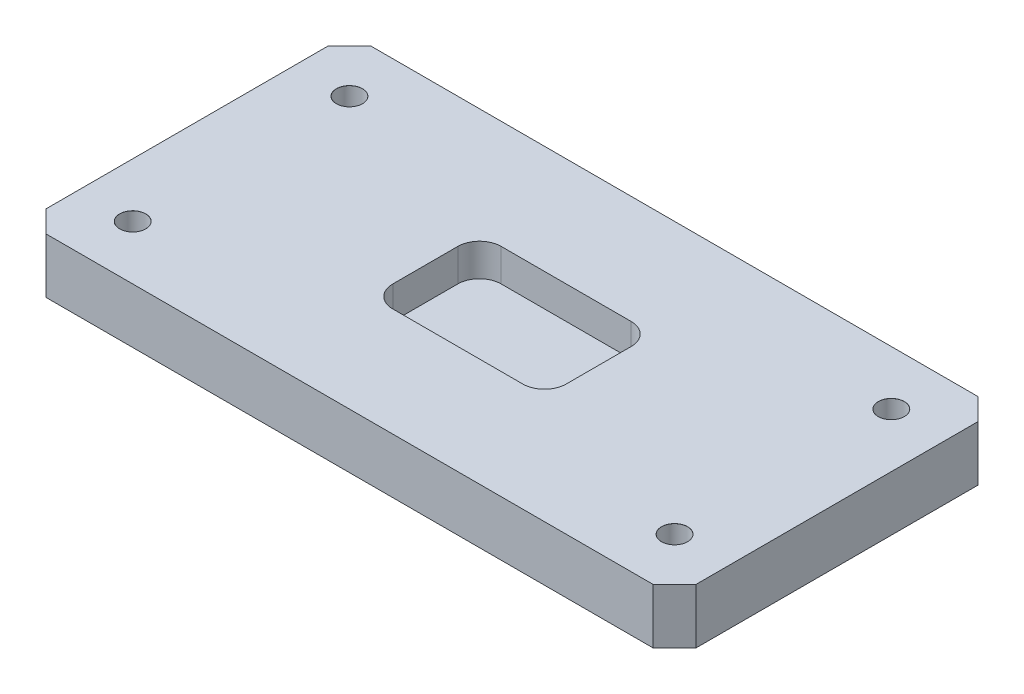
ISO-10303-21;
HEADER;
FILE_DESCRIPTION(('STEP AP214'),'2;1');
FILE_NAME('part.step','',(''),(''),'','','');
FILE_SCHEMA(('AUTOMOTIVE_DESIGN { 1 0 10303 214 1 1 1 1 }'));
ENDSEC;
DATA;
#1=APPLICATION_CONTEXT('core data for automotive mechanical design processes');
#2=APPLICATION_PROTOCOL_DEFINITION('international standard','automotive_design',2000,#1);
#3=PRODUCT_CONTEXT('',#1,'mechanical');
#4=PRODUCT('Part','Part','',(#3));
#5=PRODUCT_RELATED_PRODUCT_CATEGORY('part','',(#4));
#6=PRODUCT_DEFINITION_FORMATION('','',#4);
#7=PRODUCT_DEFINITION_CONTEXT('part definition',#1,'design');
#8=PRODUCT_DEFINITION('design','',#6,#7);
#9=PRODUCT_DEFINITION_SHAPE('','',#8);
#10=(LENGTH_UNIT() NAMED_UNIT(*) SI_UNIT(.MILLI.,.METRE.));
#11=(NAMED_UNIT(*) PLANE_ANGLE_UNIT() SI_UNIT($,.RADIAN.));
#12=(NAMED_UNIT(*) SI_UNIT($,.STERADIAN.) SOLID_ANGLE_UNIT());
#13=UNCERTAINTY_MEASURE_WITH_UNIT(LENGTH_MEASURE(1.E-05),#10,'distance_accuracy_value','');
#14=(GEOMETRIC_REPRESENTATION_CONTEXT(3) GLOBAL_UNCERTAINTY_ASSIGNED_CONTEXT((#13)) GLOBAL_UNIT_ASSIGNED_CONTEXT((#10,
#11,#12)) REPRESENTATION_CONTEXT('',''));
#15=CARTESIAN_POINT('',(0.,0.,0.));
#16=DIRECTION('',(0.,0.,1.));
#17=DIRECTION('',(1.,0.,0.));
#18=AXIS2_PLACEMENT_3D('',#15,#16,#17);
#19=CARTESIAN_POINT('',(140.,25.4,-75.));
#20=DIRECTION('',(-0.707106781186547,0.,0.707106781186548));
#21=DIRECTION('',(0.707106781186548,0.,0.707106781186547));
#22=AXIS2_PLACEMENT_3D('',#19,#20,#21);
#23=PLANE('',#22);
#24=DIRECTION('',(-0.707106781186548,0.,-0.707106781186547));
#25=VECTOR('',#24,1.);
#26=CARTESIAN_POINT('',(140.,0.,-75.));
#27=LINE('',#26,#25);
#28=CARTESIAN_POINT('',(150.,0.,-65.));
#29=VERTEX_POINT('',#28);
#30=CARTESIAN_POINT('',(140.,0.,-75.));
#31=VERTEX_POINT('',#30);
#32=EDGE_CURVE('E188',#29,#31,#27,.T.);
#33=ORIENTED_EDGE('',*,*,#32,.T.);
#34=DIRECTION('',(0.,-1.,0.));
#35=VECTOR('',#34,1.);
#36=CARTESIAN_POINT('',(140.,25.4,-75.));
#37=LINE('',#36,#35);
#38=CARTESIAN_POINT('',(140.,25.4,-75.));
#39=VERTEX_POINT('',#38);
#40=EDGE_CURVE('E167',#39,#31,#37,.T.);
#41=ORIENTED_EDGE('',*,*,#40,.F.);
#42=DIRECTION('',(-0.707106781186548,0.,-0.707106781186547));
#43=VECTOR('',#42,1.);
#44=CARTESIAN_POINT('',(140.,25.4,-75.));
#45=LINE('',#44,#43);
#46=CARTESIAN_POINT('',(150.,25.4,-65.));
#47=VERTEX_POINT('',#46);
#48=EDGE_CURVE('E175',#47,#39,#45,.T.);
#49=ORIENTED_EDGE('',*,*,#48,.F.);
#50=DIRECTION('',(0.,-1.,0.));
#51=VECTOR('',#50,1.);
#52=CARTESIAN_POINT('',(150.,25.4,-65.));
#53=LINE('',#52,#51);
#54=EDGE_CURVE('E374',#47,#29,#53,.T.);
#55=ORIENTED_EDGE('',*,*,#54,.T.);
#56=EDGE_LOOP('',(#33,#41,#49,#55));
#57=FACE_BOUND('',#56,.T.);
#58=ADVANCED_FACE('F50',(#57),#23,.F.);
#59=CARTESIAN_POINT('',(-140.,25.4,-75.));
#60=DIRECTION('',(0.,0.,1.));
#61=DIRECTION('',(1.,0.,0.));
#62=AXIS2_PLACEMENT_3D('',#59,#60,#61);
#63=PLANE('',#62);
#64=DIRECTION('',(-1.,0.,0.));
#65=VECTOR('',#64,1.);
#66=CARTESIAN_POINT('',(-140.,0.,-75.));
#67=LINE('',#66,#65);
#68=CARTESIAN_POINT('',(-140.,0.,-75.));
#69=VERTEX_POINT('',#68);
#70=EDGE_CURVE('E377',#31,#69,#67,.T.);
#71=ORIENTED_EDGE('',*,*,#70,.T.);
#72=DIRECTION('',(0.,-1.,0.));
#73=VECTOR('',#72,1.);
#74=CARTESIAN_POINT('',(-140.,25.4,-75.));
#75=LINE('',#74,#73);
#76=CARTESIAN_POINT('',(-140.,25.4,-75.));
#77=VERTEX_POINT('',#76);
#78=EDGE_CURVE('E170',#77,#69,#75,.T.);
#79=ORIENTED_EDGE('',*,*,#78,.F.);
#80=DIRECTION('',(-1.,0.,0.));
#81=VECTOR('',#80,1.);
#82=CARTESIAN_POINT('',(-140.,25.4,-75.));
#83=LINE('',#82,#81);
#84=EDGE_CURVE('E163',#39,#77,#83,.T.);
#85=ORIENTED_EDGE('',*,*,#84,.F.);
#86=ORIENTED_EDGE('',*,*,#40,.T.);
#87=EDGE_LOOP('',(#71,#79,#85,#86));
#88=FACE_BOUND('',#87,.T.);
#89=ADVANCED_FACE('F165',(#88),#63,.F.);
#90=CARTESIAN_POINT('',(-150.,25.4,-65.));
#91=DIRECTION('',(0.707106781186547,0.,0.707106781186548));
#92=DIRECTION('',(0.707106781186548,0.,-0.707106781186547));
#93=AXIS2_PLACEMENT_3D('',#90,#91,#92);
#94=PLANE('',#93);
#95=DIRECTION('',(-0.707106781186548,0.,0.707106781186547));
#96=VECTOR('',#95,1.);
#97=CARTESIAN_POINT('',(-150.,0.,-65.));
#98=LINE('',#97,#96);
#99=CARTESIAN_POINT('',(-150.,0.,-65.));
#100=VERTEX_POINT('',#99);
#101=EDGE_CURVE('E380',#69,#100,#98,.T.);
#102=ORIENTED_EDGE('',*,*,#101,.T.);
#103=DIRECTION('',(0.,-1.,0.));
#104=VECTOR('',#103,1.);
#105=CARTESIAN_POINT('',(-150.,25.4,-65.));
#106=LINE('',#105,#104);
#107=CARTESIAN_POINT('',(-150.,25.4,-65.));
#108=VERTEX_POINT('',#107);
#109=EDGE_CURVE('E196',#108,#100,#106,.T.);
#110=ORIENTED_EDGE('',*,*,#109,.F.);
#111=DIRECTION('',(-0.707106781186548,0.,0.707106781186547));
#112=VECTOR('',#111,1.);
#113=CARTESIAN_POINT('',(-150.,25.4,-65.));
#114=LINE('',#113,#112);
#115=EDGE_CURVE('E174',#77,#108,#114,.T.);
#116=ORIENTED_EDGE('',*,*,#115,.F.);
#117=ORIENTED_EDGE('',*,*,#78,.T.);
#118=EDGE_LOOP('',(#102,#110,#116,#117));
#119=FACE_BOUND('',#118,.T.);
#120=ADVANCED_FACE('F438',(#119),#94,.F.);
#121=CARTESIAN_POINT('',(-150.,25.4,-65.));
#122=DIRECTION('',(1.,0.,0.));
#123=DIRECTION('',(0.,0.,-1.));
#124=AXIS2_PLACEMENT_3D('',#121,#122,#123);
#125=PLANE('',#124);
#126=DIRECTION('',(0.,0.,1.));
#127=VECTOR('',#126,1.);
#128=CARTESIAN_POINT('',(-150.,0.,-65.));
#129=LINE('',#128,#127);
#130=CARTESIAN_POINT('',(-150.,0.,65.));
#131=VERTEX_POINT('',#130);
#132=EDGE_CURVE('E383',#100,#131,#129,.T.);
#133=ORIENTED_EDGE('',*,*,#132,.T.);
#134=DIRECTION('',(0.,-1.,0.));
#135=VECTOR('',#134,1.);
#136=CARTESIAN_POINT('',(-150.,25.4,65.));
#137=LINE('',#136,#135);
#138=CARTESIAN_POINT('',(-150.,25.4,65.));
#139=VERTEX_POINT('',#138);
#140=EDGE_CURVE('E411',#139,#131,#137,.T.);
#141=ORIENTED_EDGE('',*,*,#140,.F.);
#142=DIRECTION('',(0.,0.,1.));
#143=VECTOR('',#142,1.);
#144=CARTESIAN_POINT('',(-150.,25.4,-65.));
#145=LINE('',#144,#143);
#146=EDGE_CURVE('E360',#108,#139,#145,.T.);
#147=ORIENTED_EDGE('',*,*,#146,.F.);
#148=ORIENTED_EDGE('',*,*,#109,.T.);
#149=EDGE_LOOP('',(#133,#141,#147,#148));
#150=FACE_BOUND('',#149,.T.);
#151=ADVANCED_FACE('F420',(#150),#125,.F.);
#152=CARTESIAN_POINT('',(-150.,25.4,65.));
#153=DIRECTION('',(0.707106781186547,0.,-0.707106781186548));
#154=DIRECTION('',(-0.707106781186548,0.,-0.707106781186547));
#155=AXIS2_PLACEMENT_3D('',#152,#153,#154);
#156=PLANE('',#155);
#157=DIRECTION('',(0.707106781186548,0.,0.707106781186547));
#158=VECTOR('',#157,1.);
#159=CARTESIAN_POINT('',(-150.,0.,65.));
#160=LINE('',#159,#158);
#161=CARTESIAN_POINT('',(-140.,0.,75.));
#162=VERTEX_POINT('',#161);
#163=EDGE_CURVE('E386',#131,#162,#160,.T.);
#164=ORIENTED_EDGE('',*,*,#163,.T.);
#165=DIRECTION('',(0.,-1.,0.));
#166=VECTOR('',#165,1.);
#167=CARTESIAN_POINT('',(-140.,25.4,75.));
#168=LINE('',#167,#166);
#169=CARTESIAN_POINT('',(-140.,25.4,75.));
#170=VERTEX_POINT('',#169);
#171=EDGE_CURVE('E407',#170,#162,#168,.T.);
#172=ORIENTED_EDGE('',*,*,#171,.F.);
#173=DIRECTION('',(0.707106781186548,0.,0.707106781186547));
#174=VECTOR('',#173,1.);
#175=CARTESIAN_POINT('',(-150.,25.4,65.));
#176=LINE('',#175,#174);
#177=EDGE_CURVE('E363',#139,#170,#176,.T.);
#178=ORIENTED_EDGE('',*,*,#177,.F.);
#179=ORIENTED_EDGE('',*,*,#140,.T.);
#180=EDGE_LOOP('',(#164,#172,#178,#179));
#181=FACE_BOUND('',#180,.T.);
#182=ADVANCED_FACE('F430',(#181),#156,.F.);
#183=CARTESIAN_POINT('',(-140.,25.4,75.));
#184=DIRECTION('',(0.,0.,-1.));
#185=DIRECTION('',(-1.,0.,0.));
#186=AXIS2_PLACEMENT_3D('',#183,#184,#185);
#187=PLANE('',#186);
#188=DIRECTION('',(1.,0.,0.));
#189=VECTOR('',#188,1.);
#190=CARTESIAN_POINT('',(-140.,0.,75.));
#191=LINE('',#190,#189);
#192=CARTESIAN_POINT('',(140.,0.,75.));
#193=VERTEX_POINT('',#192);
#194=EDGE_CURVE('E389',#162,#193,#191,.T.);
#195=ORIENTED_EDGE('',*,*,#194,.T.);
#196=DIRECTION('',(0.,-1.,0.));
#197=VECTOR('',#196,1.);
#198=CARTESIAN_POINT('',(140.,25.4,75.));
#199=LINE('',#198,#197);
#200=CARTESIAN_POINT('',(140.,25.4,75.));
#201=VERTEX_POINT('',#200);
#202=EDGE_CURVE('E403',#201,#193,#199,.T.);
#203=ORIENTED_EDGE('',*,*,#202,.F.);
#204=DIRECTION('',(1.,0.,0.));
#205=VECTOR('',#204,1.);
#206=CARTESIAN_POINT('',(-140.,25.4,75.));
#207=LINE('',#206,#205);
#208=EDGE_CURVE('E366',#170,#201,#207,.T.);
#209=ORIENTED_EDGE('',*,*,#208,.F.);
#210=ORIENTED_EDGE('',*,*,#171,.T.);
#211=EDGE_LOOP('',(#195,#203,#209,#210));
#212=FACE_BOUND('',#211,.T.);
#213=ADVANCED_FACE('F434',(#212),#187,.F.);
#214=CARTESIAN_POINT('',(140.,25.4,75.));
#215=DIRECTION('',(-0.707106781186547,0.,-0.707106781186548));
#216=DIRECTION('',(-0.707106781186548,0.,0.707106781186547));
#217=AXIS2_PLACEMENT_3D('',#214,#215,#216);
#218=PLANE('',#217);
#219=DIRECTION('',(0.707106781186548,0.,-0.707106781186547));
#220=VECTOR('',#219,1.);
#221=CARTESIAN_POINT('',(140.,0.,75.));
#222=LINE('',#221,#220);
#223=CARTESIAN_POINT('',(150.,0.,65.));
#224=VERTEX_POINT('',#223);
#225=EDGE_CURVE('E392',#193,#224,#222,.T.);
#226=ORIENTED_EDGE('',*,*,#225,.T.);
#227=DIRECTION('',(0.,-1.,0.));
#228=VECTOR('',#227,1.);
#229=CARTESIAN_POINT('',(150.,25.4,65.));
#230=LINE('',#229,#228);
#231=CARTESIAN_POINT('',(150.,25.4,65.));
#232=VERTEX_POINT('',#231);
#233=EDGE_CURVE('E399',#232,#224,#230,.T.);
#234=ORIENTED_EDGE('',*,*,#233,.F.);
#235=DIRECTION('',(0.707106781186548,0.,-0.707106781186547));
#236=VECTOR('',#235,1.);
#237=CARTESIAN_POINT('',(140.,25.4,75.));
#238=LINE('',#237,#236);
#239=EDGE_CURVE('E369',#201,#232,#238,.T.);
#240=ORIENTED_EDGE('',*,*,#239,.F.);
#241=ORIENTED_EDGE('',*,*,#202,.T.);
#242=EDGE_LOOP('',(#226,#234,#240,#241));
#243=FACE_BOUND('',#242,.T.);
#244=ADVANCED_FACE('F505',(#243),#218,.F.);
#245=CARTESIAN_POINT('',(150.,25.4,-65.));
#246=DIRECTION('',(-1.,0.,0.));
#247=DIRECTION('',(0.,0.,1.));
#248=AXIS2_PLACEMENT_3D('',#245,#246,#247);
#249=PLANE('',#248);
#250=DIRECTION('',(0.,0.,-1.));
#251=VECTOR('',#250,1.);
#252=CARTESIAN_POINT('',(150.,0.,-65.));
#253=LINE('',#252,#251);
#254=EDGE_CURVE('E185',#224,#29,#253,.T.);
#255=ORIENTED_EDGE('',*,*,#254,.T.);
#256=ORIENTED_EDGE('',*,*,#54,.F.);
#257=DIRECTION('',(0.,0.,-1.));
#258=VECTOR('',#257,1.);
#259=CARTESIAN_POINT('',(150.,25.4,-65.));
#260=LINE('',#259,#258);
#261=EDGE_CURVE('E180',#232,#47,#260,.T.);
#262=ORIENTED_EDGE('',*,*,#261,.F.);
#263=ORIENTED_EDGE('',*,*,#233,.T.);
#264=EDGE_LOOP('',(#255,#256,#262,#263));
#265=FACE_BOUND('',#264,.T.);
#266=ADVANCED_FACE('F337',(#265),#249,.F.);
#267=CARTESIAN_POINT('',(0.,25.4,0.));
#268=DIRECTION('',(0.,1.,0.));
#269=DIRECTION('',(0.,0.,1.));
#270=AXIS2_PLACEMENT_3D('',#267,#268,#269);
#271=PLANE('',#270);
#272=CARTESIAN_POINT('',(-125.,25.4,-50.));
#273=DIRECTION('',(0.,1.,0.));
#274=DIRECTION('',(0.,0.,1.));
#275=AXIS2_PLACEMENT_3D('',#272,#273,#274);
#276=CIRCLE('',#275,6.025);
#277=CARTESIAN_POINT('',(-125.,25.4,-43.975));
#278=VERTEX_POINT('',#277);
#279=EDGE_CURVE('E327',#278,#278,#276,.T.);
#280=ORIENTED_EDGE('',*,*,#279,.F.);
#281=EDGE_LOOP('',(#280));
#282=FACE_BOUND('',#281,.T.);
#283=CARTESIAN_POINT('',(125.,25.4,-49.9999999999998));
#284=DIRECTION('',(0.,1.,0.));
#285=DIRECTION('',(0.,0.,1.));
#286=AXIS2_PLACEMENT_3D('',#283,#284,#285);
#287=CIRCLE('',#286,6.025);
#288=CARTESIAN_POINT('',(125.,25.4,-43.9749999999998));
#289=VERTEX_POINT('',#288);
#290=EDGE_CURVE('E315',#289,#289,#287,.T.);
#291=ORIENTED_EDGE('',*,*,#290,.F.);
#292=EDGE_LOOP('',(#291));
#293=FACE_BOUND('',#292,.T.);
#294=CARTESIAN_POINT('',(125.,25.4,49.9999999999998));
#295=DIRECTION('',(0.,1.,0.));
#296=DIRECTION('',(0.,0.,1.));
#297=AXIS2_PLACEMENT_3D('',#294,#295,#296);
#298=CIRCLE('',#297,6.025);
#299=CARTESIAN_POINT('',(125.,25.4,56.0249999999998));
#300=VERTEX_POINT('',#299);
#301=EDGE_CURVE('E303',#300,#300,#298,.T.);
#302=ORIENTED_EDGE('',*,*,#301,.F.);
#303=EDGE_LOOP('',(#302));
#304=FACE_BOUND('',#303,.T.);
#305=CARTESIAN_POINT('',(-125.,25.4,49.9999999999999));
#306=DIRECTION('',(0.,1.,0.));
#307=DIRECTION('',(0.,0.,1.));
#308=AXIS2_PLACEMENT_3D('',#305,#306,#307);
#309=CIRCLE('',#308,6.025);
#310=CARTESIAN_POINT('',(-125.,25.4,56.0249999999999));
#311=VERTEX_POINT('',#310);
#312=EDGE_CURVE('E291',#311,#311,#309,.T.);
#313=ORIENTED_EDGE('',*,*,#312,.F.);
#314=EDGE_LOOP('',(#313));
#315=FACE_BOUND('',#314,.T.);
#316=DIRECTION('',(0.,0.,-1.));
#317=VECTOR('',#316,1.);
#318=CARTESIAN_POINT('',(40.,25.4,-25.));
#319=LINE('',#318,#317);
#320=CARTESIAN_POINT('',(40.,25.4,15.));
#321=VERTEX_POINT('',#320);
#322=CARTESIAN_POINT('',(40.,25.4,-15.));
#323=VERTEX_POINT('',#322);
#324=EDGE_CURVE('E286',#321,#323,#319,.T.);
#325=ORIENTED_EDGE('',*,*,#324,.F.);
#326=CARTESIAN_POINT('',(30.,25.4,15.));
#327=DIRECTION('',(0.,1.,0.));
#328=DIRECTION('',(0.,0.,1.));
#329=AXIS2_PLACEMENT_3D('',#326,#327,#328);
#330=CIRCLE('',#329,10.);
#331=CARTESIAN_POINT('',(30.,25.4,25.));
#332=VERTEX_POINT('',#331);
#333=EDGE_CURVE('E245',#321,#332,#330,.F.);
#334=ORIENTED_EDGE('',*,*,#333,.T.);
#335=DIRECTION('',(1.,0.,0.));
#336=VECTOR('',#335,1.);
#337=CARTESIAN_POINT('',(-40.,25.4,25.));
#338=LINE('',#337,#336);
#339=CARTESIAN_POINT('',(-30.,25.4,25.));
#340=VERTEX_POINT('',#339);
#341=EDGE_CURVE('E253',#340,#332,#338,.T.);
#342=ORIENTED_EDGE('',*,*,#341,.F.);
#343=CARTESIAN_POINT('',(-30.,25.4,15.));
#344=DIRECTION('',(0.,1.,0.));
#345=DIRECTION('',(0.,0.,1.));
#346=AXIS2_PLACEMENT_3D('',#343,#344,#345);
#347=CIRCLE('',#346,10.);
#348=CARTESIAN_POINT('',(-40.,25.4,15.));
#349=VERTEX_POINT('',#348);
#350=EDGE_CURVE('E242',#340,#349,#347,.F.);
#351=ORIENTED_EDGE('',*,*,#350,.T.);
#352=DIRECTION('',(0.,0.,1.));
#353=VECTOR('',#352,1.);
#354=CARTESIAN_POINT('',(-40.,25.4,-25.));
#355=LINE('',#354,#353);
#356=CARTESIAN_POINT('',(-40.,25.4,-15.));
#357=VERTEX_POINT('',#356);
#358=EDGE_CURVE('E251',#357,#349,#355,.T.);
#359=ORIENTED_EDGE('',*,*,#358,.F.);
#360=CARTESIAN_POINT('',(-30.,25.4,-15.));
#361=DIRECTION('',(0.,1.,0.));
#362=DIRECTION('',(0.,0.,1.));
#363=AXIS2_PLACEMENT_3D('',#360,#361,#362);
#364=CIRCLE('',#363,10.);
#365=CARTESIAN_POINT('',(-30.,25.4,-25.));
#366=VERTEX_POINT('',#365);
#367=EDGE_CURVE('E59',#357,#366,#364,.F.);
#368=ORIENTED_EDGE('',*,*,#367,.T.);
#369=DIRECTION('',(-1.,0.,0.));
#370=VECTOR('',#369,1.);
#371=CARTESIAN_POINT('',(-40.,25.4,-25.));
#372=LINE('',#371,#370);
#373=CARTESIAN_POINT('',(30.,25.4,-25.));
#374=VERTEX_POINT('',#373);
#375=EDGE_CURVE('E250',#374,#366,#372,.T.);
#376=ORIENTED_EDGE('',*,*,#375,.F.);
#377=CARTESIAN_POINT('',(30.,25.4,-15.));
#378=DIRECTION('',(0.,1.,0.));
#379=DIRECTION('',(0.,0.,1.));
#380=AXIS2_PLACEMENT_3D('',#377,#378,#379);
#381=CIRCLE('',#380,10.);
#382=EDGE_CURVE('E12',#374,#323,#381,.F.);
#383=ORIENTED_EDGE('',*,*,#382,.T.);
#384=EDGE_LOOP('',(#325,#334,#342,#351,#359,#368,#376,#383));
#385=FACE_BOUND('',#384,.T.);
#386=ORIENTED_EDGE('',*,*,#48,.T.);
#387=ORIENTED_EDGE('',*,*,#84,.T.);
#388=ORIENTED_EDGE('',*,*,#115,.T.);
#389=ORIENTED_EDGE('',*,*,#146,.T.);
#390=ORIENTED_EDGE('',*,*,#177,.T.);
#391=ORIENTED_EDGE('',*,*,#208,.T.);
#392=ORIENTED_EDGE('',*,*,#239,.T.);
#393=ORIENTED_EDGE('',*,*,#261,.T.);
#394=EDGE_LOOP('',(#386,#387,#388,#389,#390,#391,#392,#393));
#395=FACE_BOUND('',#394,.T.);
#396=ADVANCED_FACE('F178',(#282,#293,#304,#315,#385,#395),#271,.T.);
#397=CARTESIAN_POINT('',(0.,0.,0.));
#398=DIRECTION('',(0.,1.,0.));
#399=DIRECTION('',(0.,0.,1.));
#400=AXIS2_PLACEMENT_3D('',#397,#398,#399);
#401=PLANE('',#400);
#402=CARTESIAN_POINT('',(-125.,0.,-50.));
#403=DIRECTION('',(0.,1.,0.));
#404=DIRECTION('',(0.,0.,1.));
#405=AXIS2_PLACEMENT_3D('',#402,#403,#404);
#406=CIRCLE('',#405,5.99999999999999);
#407=CARTESIAN_POINT('',(-125.,0.,-44.));
#408=VERTEX_POINT('',#407);
#409=EDGE_CURVE('E319',#408,#408,#406,.T.);
#410=ORIENTED_EDGE('',*,*,#409,.T.);
#411=EDGE_LOOP('',(#410));
#412=FACE_BOUND('',#411,.T.);
#413=CARTESIAN_POINT('',(125.,0.,-49.9999999999998));
#414=DIRECTION('',(0.,1.,0.));
#415=DIRECTION('',(0.,0.,1.));
#416=AXIS2_PLACEMENT_3D('',#413,#414,#415);
#417=CIRCLE('',#416,6.00000000000001);
#418=CARTESIAN_POINT('',(125.,0.,-43.9999999999998));
#419=VERTEX_POINT('',#418);
#420=EDGE_CURVE('E307',#419,#419,#417,.T.);
#421=ORIENTED_EDGE('',*,*,#420,.T.);
#422=EDGE_LOOP('',(#421));
#423=FACE_BOUND('',#422,.T.);
#424=CARTESIAN_POINT('',(125.,0.,49.9999999999998));
#425=DIRECTION('',(0.,1.,0.));
#426=DIRECTION('',(0.,0.,1.));
#427=AXIS2_PLACEMENT_3D('',#424,#425,#426);
#428=CIRCLE('',#427,6.00000000000001);
#429=CARTESIAN_POINT('',(125.,0.,55.9999999999998));
#430=VERTEX_POINT('',#429);
#431=EDGE_CURVE('E295',#430,#430,#428,.T.);
#432=ORIENTED_EDGE('',*,*,#431,.T.);
#433=EDGE_LOOP('',(#432));
#434=FACE_BOUND('',#433,.T.);
#435=CARTESIAN_POINT('',(-125.,0.,49.9999999999999));
#436=DIRECTION('',(0.,1.,0.));
#437=DIRECTION('',(0.,0.,1.));
#438=AXIS2_PLACEMENT_3D('',#435,#436,#437);
#439=CIRCLE('',#438,5.99999999999999);
#440=CARTESIAN_POINT('',(-125.,0.,55.9999999999999));
#441=VERTEX_POINT('',#440);
#442=EDGE_CURVE('E282',#441,#441,#439,.T.);
#443=ORIENTED_EDGE('',*,*,#442,.T.);
#444=EDGE_LOOP('',(#443));
#445=FACE_BOUND('',#444,.T.);
#446=ORIENTED_EDGE('',*,*,#32,.F.);
#447=ORIENTED_EDGE('',*,*,#254,.F.);
#448=ORIENTED_EDGE('',*,*,#225,.F.);
#449=ORIENTED_EDGE('',*,*,#194,.F.);
#450=ORIENTED_EDGE('',*,*,#163,.F.);
#451=ORIENTED_EDGE('',*,*,#132,.F.);
#452=ORIENTED_EDGE('',*,*,#101,.F.);
#453=ORIENTED_EDGE('',*,*,#70,.F.);
#454=EDGE_LOOP('',(#446,#447,#448,#449,#450,#451,#452,#453));
#455=FACE_BOUND('',#454,.T.);
#456=ADVANCED_FACE('F336',(#412,#423,#434,#445,#455),#401,.F.);
#457=CARTESIAN_POINT('',(40.,10.4,-25.));
#458=DIRECTION('',(1.,0.,0.));
#459=DIRECTION('',(0.,0.,-1.));
#460=AXIS2_PLACEMENT_3D('',#457,#458,#459);
#461=PLANE('',#460);
#462=DIRECTION('',(0.,0.,-1.));
#463=VECTOR('',#462,1.);
#464=CARTESIAN_POINT('',(40.,10.4,-25.));
#465=LINE('',#464,#463);
#466=CARTESIAN_POINT('',(40.,10.4,15.));
#467=VERTEX_POINT('',#466);
#468=CARTESIAN_POINT('',(40.,10.4,-15.));
#469=VERTEX_POINT('',#468);
#470=EDGE_CURVE('E261',#467,#469,#465,.T.);
#471=ORIENTED_EDGE('',*,*,#470,.F.);
#472=DIRECTION('',(0.,1.,0.));
#473=VECTOR('',#472,1.);
#474=CARTESIAN_POINT('',(40.,25.4,15.));
#475=LINE('',#474,#473);
#476=EDGE_CURVE('E232',#467,#321,#475,.T.);
#477=ORIENTED_EDGE('',*,*,#476,.T.);
#478=ORIENTED_EDGE('',*,*,#324,.T.);
#479=DIRECTION('',(0.,1.,0.));
#480=VECTOR('',#479,1.);
#481=CARTESIAN_POINT('',(40.,10.4,-15.));
#482=LINE('',#481,#480);
#483=EDGE_CURVE('E229',#323,#469,#482,.F.);
#484=ORIENTED_EDGE('',*,*,#483,.T.);
#485=EDGE_LOOP('',(#471,#477,#478,#484));
#486=FACE_BOUND('',#485,.T.);
#487=ADVANCED_FACE('F485',(#486),#461,.F.);
#488=CARTESIAN_POINT('',(-40.,10.4,25.));
#489=DIRECTION('',(0.,0.,1.));
#490=DIRECTION('',(1.,0.,0.));
#491=AXIS2_PLACEMENT_3D('',#488,#489,#490);
#492=PLANE('',#491);
#493=DIRECTION('',(1.,0.,0.));
#494=VECTOR('',#493,1.);
#495=CARTESIAN_POINT('',(-40.,10.4,25.));
#496=LINE('',#495,#494);
#497=CARTESIAN_POINT('',(-30.,10.4,25.));
#498=VERTEX_POINT('',#497);
#499=CARTESIAN_POINT('',(30.,10.4,25.));
#500=VERTEX_POINT('',#499);
#501=EDGE_CURVE('E256',#498,#500,#496,.T.);
#502=ORIENTED_EDGE('',*,*,#501,.F.);
#503=DIRECTION('',(0.,1.,0.));
#504=VECTOR('',#503,1.);
#505=CARTESIAN_POINT('',(-30.,25.4,25.));
#506=LINE('',#505,#504);
#507=EDGE_CURVE('E194',#498,#340,#506,.T.);
#508=ORIENTED_EDGE('',*,*,#507,.T.);
#509=ORIENTED_EDGE('',*,*,#341,.T.);
#510=DIRECTION('',(0.,1.,0.));
#511=VECTOR('',#510,1.);
#512=CARTESIAN_POINT('',(30.,10.4,25.));
#513=LINE('',#512,#511);
#514=EDGE_CURVE('E190',#332,#500,#513,.F.);
#515=ORIENTED_EDGE('',*,*,#514,.T.);
#516=EDGE_LOOP('',(#502,#508,#509,#515));
#517=FACE_BOUND('',#516,.T.);
#518=ADVANCED_FACE('F480',(#517),#492,.F.);
#519=CARTESIAN_POINT('',(-40.,10.4,-25.));
#520=DIRECTION('',(-1.,0.,0.));
#521=DIRECTION('',(0.,0.,1.));
#522=AXIS2_PLACEMENT_3D('',#519,#520,#521);
#523=PLANE('',#522);
#524=ORIENTED_EDGE('',*,*,#358,.T.);
#525=DIRECTION('',(0.,1.,0.));
#526=VECTOR('',#525,1.);
#527=CARTESIAN_POINT('',(-40.,10.4,15.));
#528=LINE('',#527,#526);
#529=CARTESIAN_POINT('',(-40.,10.4,15.));
#530=VERTEX_POINT('',#529);
#531=EDGE_CURVE('E207',#349,#530,#528,.F.);
#532=ORIENTED_EDGE('',*,*,#531,.T.);
#533=DIRECTION('',(0.,0.,1.));
#534=VECTOR('',#533,1.);
#535=CARTESIAN_POINT('',(-40.,10.4,-25.));
#536=LINE('',#535,#534);
#537=CARTESIAN_POINT('',(-40.,10.4,-15.));
#538=VERTEX_POINT('',#537);
#539=EDGE_CURVE('E258',#538,#530,#536,.T.);
#540=ORIENTED_EDGE('',*,*,#539,.F.);
#541=DIRECTION('',(0.,1.,0.));
#542=VECTOR('',#541,1.);
#543=CARTESIAN_POINT('',(-40.,25.4,-15.));
#544=LINE('',#543,#542);
#545=EDGE_CURVE('E203',#538,#357,#544,.T.);
#546=ORIENTED_EDGE('',*,*,#545,.T.);
#547=EDGE_LOOP('',(#524,#532,#540,#546));
#548=FACE_BOUND('',#547,.T.);
#549=ADVANCED_FACE('F474',(#548),#523,.F.);
#550=CARTESIAN_POINT('',(-40.,10.4,-25.));
#551=DIRECTION('',(0.,0.,-1.));
#552=DIRECTION('',(-1.,0.,0.));
#553=AXIS2_PLACEMENT_3D('',#550,#551,#552);
#554=PLANE('',#553);
#555=ORIENTED_EDGE('',*,*,#375,.T.);
#556=DIRECTION('',(0.,1.,0.));
#557=VECTOR('',#556,1.);
#558=CARTESIAN_POINT('',(-30.,10.4,-25.));
#559=LINE('',#558,#557);
#560=CARTESIAN_POINT('',(-30.,10.4,-25.));
#561=VERTEX_POINT('',#560);
#562=EDGE_CURVE('E239',#366,#561,#559,.F.);
#563=ORIENTED_EDGE('',*,*,#562,.T.);
#564=DIRECTION('',(-1.,0.,0.));
#565=VECTOR('',#564,1.);
#566=CARTESIAN_POINT('',(-40.,10.4,-25.));
#567=LINE('',#566,#565);
#568=CARTESIAN_POINT('',(30.,10.4,-25.));
#569=VERTEX_POINT('',#568);
#570=EDGE_CURVE('E263',#569,#561,#567,.T.);
#571=ORIENTED_EDGE('',*,*,#570,.F.);
#572=DIRECTION('',(0.,1.,0.));
#573=VECTOR('',#572,1.);
#574=CARTESIAN_POINT('',(30.,25.4,-25.));
#575=LINE('',#574,#573);
#576=EDGE_CURVE('E236',#569,#374,#575,.T.);
#577=ORIENTED_EDGE('',*,*,#576,.T.);
#578=EDGE_LOOP('',(#555,#563,#571,#577));
#579=FACE_BOUND('',#578,.T.);
#580=ADVANCED_FACE('F487',(#579),#554,.F.);
#581=CARTESIAN_POINT('',(0.,10.4,0.));
#582=DIRECTION('',(0.,1.,0.));
#583=DIRECTION('',(0.,0.,1.));
#584=AXIS2_PLACEMENT_3D('',#581,#582,#583);
#585=PLANE('',#584);
#586=ORIENTED_EDGE('',*,*,#539,.T.);
#587=CARTESIAN_POINT('',(-30.,10.4,15.));
#588=DIRECTION('',(0.,1.,0.));
#589=DIRECTION('',(0.,0.,1.));
#590=AXIS2_PLACEMENT_3D('',#587,#588,#589);
#591=CIRCLE('',#590,10.);
#592=EDGE_CURVE('E225',#530,#498,#591,.T.);
#593=ORIENTED_EDGE('',*,*,#592,.T.);
#594=ORIENTED_EDGE('',*,*,#501,.T.);
#595=CARTESIAN_POINT('',(30.,10.4,15.));
#596=DIRECTION('',(0.,1.,0.));
#597=DIRECTION('',(0.,0.,1.));
#598=AXIS2_PLACEMENT_3D('',#595,#596,#597);
#599=CIRCLE('',#598,10.);
#600=EDGE_CURVE('E222',#500,#467,#599,.T.);
#601=ORIENTED_EDGE('',*,*,#600,.T.);
#602=ORIENTED_EDGE('',*,*,#470,.T.);
#603=CARTESIAN_POINT('',(30.,10.4,-15.));
#604=DIRECTION('',(0.,1.,0.));
#605=DIRECTION('',(0.,0.,1.));
#606=AXIS2_PLACEMENT_3D('',#603,#604,#605);
#607=CIRCLE('',#606,10.);
#608=EDGE_CURVE('E210',#469,#569,#607,.T.);
#609=ORIENTED_EDGE('',*,*,#608,.T.);
#610=ORIENTED_EDGE('',*,*,#570,.T.);
#611=CARTESIAN_POINT('',(-30.,10.4,-15.));
#612=DIRECTION('',(0.,1.,0.));
#613=DIRECTION('',(0.,0.,1.));
#614=AXIS2_PLACEMENT_3D('',#611,#612,#613);
#615=CIRCLE('',#614,10.);
#616=EDGE_CURVE('E214',#561,#538,#615,.T.);
#617=ORIENTED_EDGE('',*,*,#616,.T.);
#618=EDGE_LOOP('',(#586,#593,#594,#601,#602,#609,#610,#617));
#619=FACE_BOUND('',#618,.T.);
#620=ADVANCED_FACE('F458',(#619),#585,.T.);
#621=CARTESIAN_POINT('',(-30.,10.4,15.));
#622=DIRECTION('',(0.,-1.,0.));
#623=DIRECTION('',(0.,0.,-1.));
#624=AXIS2_PLACEMENT_3D('',#621,#622,#623);
#625=CYLINDRICAL_SURFACE('',#624,10.);
#626=ORIENTED_EDGE('',*,*,#592,.F.);
#627=ORIENTED_EDGE('',*,*,#531,.F.);
#628=ORIENTED_EDGE('',*,*,#350,.F.);
#629=ORIENTED_EDGE('',*,*,#507,.F.);
#630=EDGE_LOOP('',(#626,#627,#628,#629));
#631=FACE_BOUND('',#630,.T.);
#632=ADVANCED_FACE('F454',(#631),#625,.F.);
#633=CARTESIAN_POINT('',(30.,10.4,15.));
#634=DIRECTION('',(0.,-1.,0.));
#635=DIRECTION('',(0.,0.,-1.));
#636=AXIS2_PLACEMENT_3D('',#633,#634,#635);
#637=CYLINDRICAL_SURFACE('',#636,10.);
#638=ORIENTED_EDGE('',*,*,#600,.F.);
#639=ORIENTED_EDGE('',*,*,#514,.F.);
#640=ORIENTED_EDGE('',*,*,#333,.F.);
#641=ORIENTED_EDGE('',*,*,#476,.F.);
#642=EDGE_LOOP('',(#638,#639,#640,#641));
#643=FACE_BOUND('',#642,.T.);
#644=ADVANCED_FACE('F457',(#643),#637,.F.);
#645=CARTESIAN_POINT('',(-30.,10.4,-15.));
#646=DIRECTION('',(0.,-1.,0.));
#647=DIRECTION('',(0.,0.,-1.));
#648=AXIS2_PLACEMENT_3D('',#645,#646,#647);
#649=CYLINDRICAL_SURFACE('',#648,10.);
#650=ORIENTED_EDGE('',*,*,#616,.F.);
#651=ORIENTED_EDGE('',*,*,#562,.F.);
#652=ORIENTED_EDGE('',*,*,#367,.F.);
#653=ORIENTED_EDGE('',*,*,#545,.F.);
#654=EDGE_LOOP('',(#650,#651,#652,#653));
#655=FACE_BOUND('',#654,.T.);
#656=ADVANCED_FACE('F461',(#655),#649,.F.);
#657=CARTESIAN_POINT('',(30.,10.4,-15.));
#658=DIRECTION('',(0.,-1.,0.));
#659=DIRECTION('',(0.,0.,-1.));
#660=AXIS2_PLACEMENT_3D('',#657,#658,#659);
#661=CYLINDRICAL_SURFACE('',#660,10.);
#662=ORIENTED_EDGE('',*,*,#608,.F.);
#663=ORIENTED_EDGE('',*,*,#483,.F.);
#664=ORIENTED_EDGE('',*,*,#382,.F.);
#665=ORIENTED_EDGE('',*,*,#576,.F.);
#666=EDGE_LOOP('',(#662,#663,#664,#665));
#667=FACE_BOUND('',#666,.T.);
#668=ADVANCED_FACE('F52',(#667),#661,.F.);
#669=CARTESIAN_POINT('',(-125.,25.4,49.9999999999999));
#670=DIRECTION('',(0.,1.,0.));
#671=DIRECTION('',(0.,0.,1.));
#672=AXIS2_PLACEMENT_3D('',#669,#670,#671);
#673=CYLINDRICAL_SURFACE('',#672,6.);
#674=ORIENTED_EDGE('',*,*,#442,.F.);
#675=EDGE_LOOP('',(#674));
#676=FACE_BOUND('',#675,.T.);
#677=CARTESIAN_POINT('',(-125.,25.3790225092206,49.9999999999999));
#678=DIRECTION('',(0.,1.,0.));
#679=DIRECTION('',(0.,0.,1.));
#680=AXIS2_PLACEMENT_3D('',#677,#678,#679);
#681=CIRCLE('',#680,6.00000000000001);
#682=CARTESIAN_POINT('',(-125.,25.3790225092206,55.9999999999999));
#683=VERTEX_POINT('',#682);
#684=EDGE_CURVE('E287',#683,#683,#681,.T.);
#685=ORIENTED_EDGE('',*,*,#684,.T.);
#686=EDGE_LOOP('',(#685));
#687=FACE_BOUND('',#686,.T.);
#688=ADVANCED_FACE('F468',(#676,#687),#673,.F.);
#689=CARTESIAN_POINT('',(-125.,25.4,49.9999999999999));
#690=DIRECTION('',(0.,1.,0.));
#691=DIRECTION('',(0.,0.,1.));
#692=AXIS2_PLACEMENT_3D('',#689,#690,#691);
#693=CONICAL_SURFACE('',#692,6.025,0.872664625997009);
#694=ORIENTED_EDGE('',*,*,#684,.F.);
#695=EDGE_LOOP('',(#694));
#696=FACE_BOUND('',#695,.T.);
#697=ORIENTED_EDGE('',*,*,#312,.T.);
#698=EDGE_LOOP('',(#697));
#699=FACE_BOUND('',#698,.T.);
#700=ADVANCED_FACE('F619',(#696,#699),#693,.F.);
#701=CARTESIAN_POINT('',(125.,25.4,49.9999999999998));
#702=DIRECTION('',(0.,1.,0.));
#703=DIRECTION('',(0.,0.,1.));
#704=AXIS2_PLACEMENT_3D('',#701,#702,#703);
#705=CYLINDRICAL_SURFACE('',#704,6.00000000000001);
#706=ORIENTED_EDGE('',*,*,#431,.F.);
#707=EDGE_LOOP('',(#706));
#708=FACE_BOUND('',#707,.T.);
#709=CARTESIAN_POINT('',(125.,25.3790225092206,49.9999999999998));
#710=DIRECTION('',(0.,1.,0.));
#711=DIRECTION('',(0.,0.,1.));
#712=AXIS2_PLACEMENT_3D('',#709,#710,#711);
#713=CIRCLE('',#712,6.00000000000001);
#714=CARTESIAN_POINT('',(125.,25.3790225092206,55.9999999999998));
#715=VERTEX_POINT('',#714);
#716=EDGE_CURVE('E299',#715,#715,#713,.T.);
#717=ORIENTED_EDGE('',*,*,#716,.T.);
#718=EDGE_LOOP('',(#717));
#719=FACE_BOUND('',#718,.T.);
#720=ADVANCED_FACE('F630',(#708,#719),#705,.F.);
#721=CARTESIAN_POINT('',(125.,25.4,49.9999999999998));
#722=DIRECTION('',(0.,1.,0.));
#723=DIRECTION('',(0.,0.,1.));
#724=AXIS2_PLACEMENT_3D('',#721,#722,#723);
#725=CONICAL_SURFACE('',#724,6.025,0.872664625997009);
#726=ORIENTED_EDGE('',*,*,#716,.F.);
#727=EDGE_LOOP('',(#726));
#728=FACE_BOUND('',#727,.T.);
#729=ORIENTED_EDGE('',*,*,#301,.T.);
#730=EDGE_LOOP('',(#729));
#731=FACE_BOUND('',#730,.T.);
#732=ADVANCED_FACE('F641',(#728,#731),#725,.F.);
#733=CARTESIAN_POINT('',(125.,25.4,-49.9999999999998));
#734=DIRECTION('',(0.,1.,0.));
#735=DIRECTION('',(0.,0.,1.));
#736=AXIS2_PLACEMENT_3D('',#733,#734,#735);
#737=CYLINDRICAL_SURFACE('',#736,6.00000000000001);
#738=ORIENTED_EDGE('',*,*,#420,.F.);
#739=EDGE_LOOP('',(#738));
#740=FACE_BOUND('',#739,.T.);
#741=CARTESIAN_POINT('',(125.,25.3790225092206,-49.9999999999998));
#742=DIRECTION('',(0.,1.,0.));
#743=DIRECTION('',(0.,0.,1.));
#744=AXIS2_PLACEMENT_3D('',#741,#742,#743);
#745=CIRCLE('',#744,6.00000000000001);
#746=CARTESIAN_POINT('',(125.,25.3790225092206,-43.9999999999998));
#747=VERTEX_POINT('',#746);
#748=EDGE_CURVE('E311',#747,#747,#745,.T.);
#749=ORIENTED_EDGE('',*,*,#748,.T.);
#750=EDGE_LOOP('',(#749));
#751=FACE_BOUND('',#750,.T.);
#752=ADVANCED_FACE('F652',(#740,#751),#737,.F.);
#753=CARTESIAN_POINT('',(125.,25.4,-49.9999999999998));
#754=DIRECTION('',(0.,1.,0.));
#755=DIRECTION('',(0.,0.,1.));
#756=AXIS2_PLACEMENT_3D('',#753,#754,#755);
#757=CONICAL_SURFACE('',#756,6.025,0.872664625997009);
#758=ORIENTED_EDGE('',*,*,#748,.F.);
#759=EDGE_LOOP('',(#758));
#760=FACE_BOUND('',#759,.T.);
#761=ORIENTED_EDGE('',*,*,#290,.T.);
#762=EDGE_LOOP('',(#761));
#763=FACE_BOUND('',#762,.T.);
#764=ADVANCED_FACE('F663',(#760,#763),#757,.F.);
#765=CARTESIAN_POINT('',(-125.,25.4,-50.));
#766=DIRECTION('',(0.,1.,0.));
#767=DIRECTION('',(0.,0.,1.));
#768=AXIS2_PLACEMENT_3D('',#765,#766,#767);
#769=CYLINDRICAL_SURFACE('',#768,6.);
#770=ORIENTED_EDGE('',*,*,#409,.F.);
#771=EDGE_LOOP('',(#770));
#772=FACE_BOUND('',#771,.T.);
#773=CARTESIAN_POINT('',(-125.,25.3790225092206,-50.));
#774=DIRECTION('',(0.,1.,0.));
#775=DIRECTION('',(0.,0.,1.));
#776=AXIS2_PLACEMENT_3D('',#773,#774,#775);
#777=CIRCLE('',#776,6.00000000000001);
#778=CARTESIAN_POINT('',(-125.,25.3790225092206,-44.));
#779=VERTEX_POINT('',#778);
#780=EDGE_CURVE('E323',#779,#779,#777,.T.);
#781=ORIENTED_EDGE('',*,*,#780,.T.);
#782=EDGE_LOOP('',(#781));
#783=FACE_BOUND('',#782,.T.);
#784=ADVANCED_FACE('F674',(#772,#783),#769,.F.);
#785=CARTESIAN_POINT('',(-125.,25.4,-50.));
#786=DIRECTION('',(0.,1.,0.));
#787=DIRECTION('',(0.,0.,1.));
#788=AXIS2_PLACEMENT_3D('',#785,#786,#787);
#789=CONICAL_SURFACE('',#788,6.025,0.872664625997009);
#790=ORIENTED_EDGE('',*,*,#780,.F.);
#791=EDGE_LOOP('',(#790));
#792=FACE_BOUND('',#791,.T.);
#793=ORIENTED_EDGE('',*,*,#279,.T.);
#794=EDGE_LOOP('',(#793));
#795=FACE_BOUND('',#794,.T.);
#796=ADVANCED_FACE('F332',(#792,#795),#789,.F.);
#797=CLOSED_SHELL('',(#58,#89,#120,#151,#182,#213,#244,#266,#396,#456,#487,#518,#549,#580,#620,
#632,#644,#656,#668,#688,#700,#720,#732,#752,#764,#784,#796));
#798=MANIFOLD_SOLID_BREP('B2',#797);
#799=ADVANCED_BREP_SHAPE_REPRESENTATION('',(#18,#798),#14);
#800=SHAPE_DEFINITION_REPRESENTATION(#9,#799);
ENDSEC;
END-ISO-10303-21;
